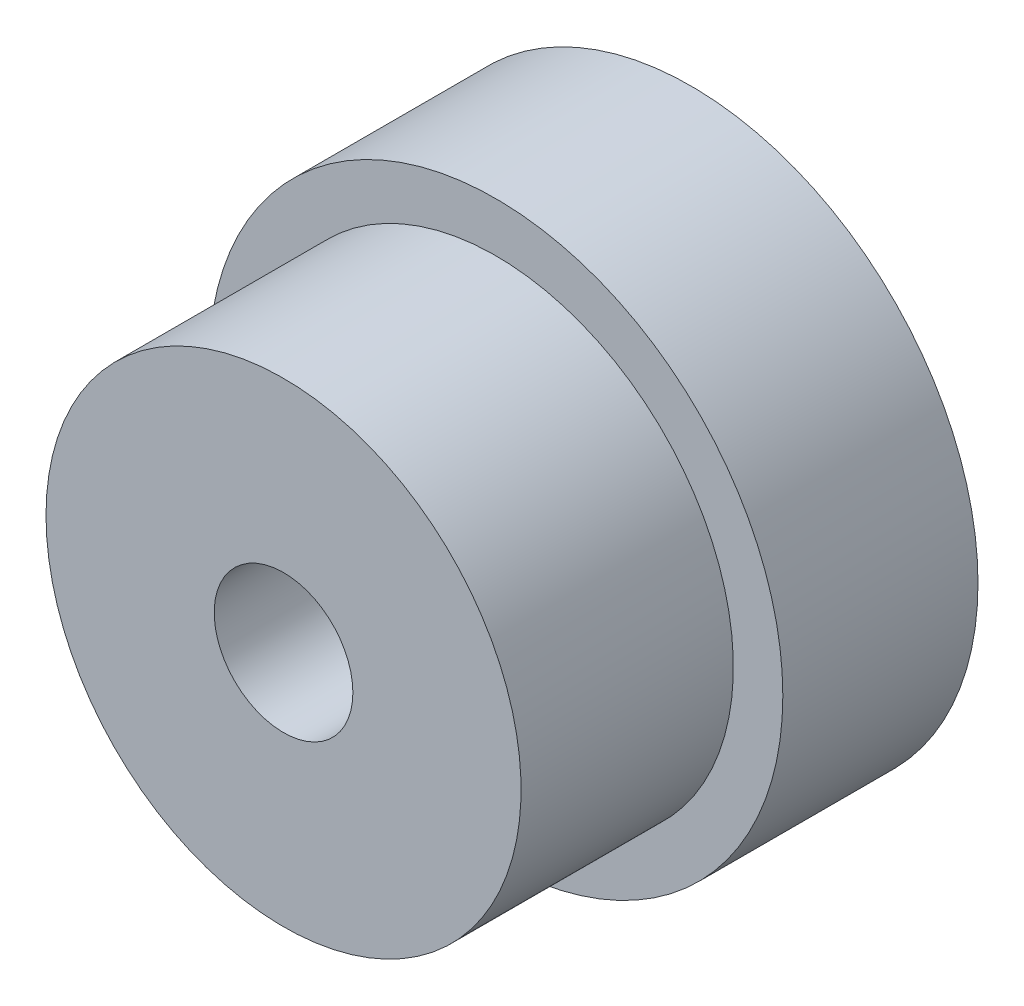
ISO-10303-21;
HEADER;
FILE_DESCRIPTION(('STEP AP214'),'2;1');
FILE_NAME('part.step','',(''),(''),'','','');
FILE_SCHEMA(('AUTOMOTIVE_DESIGN { 1 0 10303 214 1 1 1 1 }'));
ENDSEC;
DATA;
#1=APPLICATION_CONTEXT('core data for automotive mechanical design processes');
#2=APPLICATION_PROTOCOL_DEFINITION('international standard','automotive_design',2000,#1);
#3=PRODUCT_CONTEXT('',#1,'mechanical');
#4=PRODUCT('Part','Part','',(#3));
#5=PRODUCT_RELATED_PRODUCT_CATEGORY('part','',(#4));
#6=PRODUCT_DEFINITION_FORMATION('','',#4);
#7=PRODUCT_DEFINITION_CONTEXT('part definition',#1,'design');
#8=PRODUCT_DEFINITION('design','',#6,#7);
#9=PRODUCT_DEFINITION_SHAPE('','',#8);
#10=(LENGTH_UNIT() NAMED_UNIT(*) SI_UNIT(.MILLI.,.METRE.));
#11=(NAMED_UNIT(*) PLANE_ANGLE_UNIT() SI_UNIT($,.RADIAN.));
#12=(NAMED_UNIT(*) SI_UNIT($,.STERADIAN.) SOLID_ANGLE_UNIT());
#13=UNCERTAINTY_MEASURE_WITH_UNIT(LENGTH_MEASURE(1.E-05),#10,'distance_accuracy_value','');
#14=(GEOMETRIC_REPRESENTATION_CONTEXT(3) GLOBAL_UNCERTAINTY_ASSIGNED_CONTEXT((#13)) GLOBAL_UNIT_ASSIGNED_CONTEXT((#10,
#11,#12)) REPRESENTATION_CONTEXT('',''));
#15=CARTESIAN_POINT('',(0.,0.,0.));
#16=DIRECTION('',(0.,0.,1.));
#17=DIRECTION('',(1.,0.,0.));
#18=AXIS2_PLACEMENT_3D('',#15,#16,#17);
#19=CARTESIAN_POINT('',(0.,0.,11.4));
#20=DIRECTION('',(0.,0.,-1.));
#21=DIRECTION('',(-1.,0.,0.));
#22=AXIS2_PLACEMENT_3D('',#19,#20,#21);
#23=CYLINDRICAL_SURFACE('',#22,16.765);
#24=CARTESIAN_POINT('',(0.,0.,11.4));
#25=DIRECTION('',(0.,0.,1.));
#26=DIRECTION('',(1.,0.,0.));
#27=AXIS2_PLACEMENT_3D('',#24,#25,#26);
#28=CIRCLE('',#27,16.765);
#29=CARTESIAN_POINT('',(16.765,0.,11.4));
#30=VERTEX_POINT('',#29);
#31=EDGE_CURVE('E10',#30,#30,#28,.T.);
#32=ORIENTED_EDGE('',*,*,#31,.F.);
#33=EDGE_LOOP('',(#32));
#34=FACE_BOUND('',#33,.T.);
#35=CARTESIAN_POINT('',(0.,0.,0.));
#36=DIRECTION('',(0.,0.,1.));
#37=DIRECTION('',(1.,0.,0.));
#38=AXIS2_PLACEMENT_3D('',#35,#36,#37);
#39=CIRCLE('',#38,16.765);
#40=CARTESIAN_POINT('',(16.765,0.,0.));
#41=VERTEX_POINT('',#40);
#42=EDGE_CURVE('E34',#41,#41,#39,.T.);
#43=ORIENTED_EDGE('',*,*,#42,.T.);
#44=EDGE_LOOP('',(#43));
#45=FACE_BOUND('',#44,.T.);
#46=ADVANCED_FACE('F31',(#34,#45),#23,.T.);
#47=CARTESIAN_POINT('',(0.,0.,11.4));
#48=DIRECTION('',(0.,0.,1.));
#49=DIRECTION('',(1.,0.,0.));
#50=AXIS2_PLACEMENT_3D('',#47,#48,#49);
#51=PLANE('',#50);
#52=CARTESIAN_POINT('',(0.,0.,11.4));
#53=DIRECTION('',(0.,0.,1.));
#54=DIRECTION('',(1.,0.,0.));
#55=AXIS2_PLACEMENT_3D('',#52,#53,#54);
#56=CIRCLE('',#55,13.875);
#57=CARTESIAN_POINT('',(-13.875,0.,11.4));
#58=VERTEX_POINT('',#57);
#59=EDGE_CURVE('E43',#58,#58,#56,.T.);
#60=ORIENTED_EDGE('',*,*,#59,.F.);
#61=EDGE_LOOP('',(#60));
#62=FACE_BOUND('',#61,.T.);
#63=ORIENTED_EDGE('',*,*,#31,.T.);
#64=EDGE_LOOP('',(#63));
#65=FACE_BOUND('',#64,.T.);
#66=ADVANCED_FACE('F71',(#62,#65),#51,.T.);
#67=CARTESIAN_POINT('',(0.,0.,0.));
#68=DIRECTION('',(0.,0.,1.));
#69=DIRECTION('',(1.,0.,0.));
#70=AXIS2_PLACEMENT_3D('',#67,#68,#69);
#71=PLANE('',#70);
#72=CARTESIAN_POINT('',(0.,0.,0.));
#73=DIRECTION('',(0.,0.,1.));
#74=DIRECTION('',(1.,0.,0.));
#75=AXIS2_PLACEMENT_3D('',#72,#73,#74);
#76=CIRCLE('',#75,4.05);
#77=CARTESIAN_POINT('',(4.05,0.,0.));
#78=VERTEX_POINT('',#77);
#79=EDGE_CURVE('E46',#78,#78,#76,.T.);
#80=ORIENTED_EDGE('',*,*,#79,.T.);
#81=EDGE_LOOP('',(#80));
#82=FACE_BOUND('',#81,.T.);
#83=ORIENTED_EDGE('',*,*,#42,.F.);
#84=EDGE_LOOP('',(#83));
#85=FACE_BOUND('',#84,.T.);
#86=ADVANCED_FACE('F67',(#82,#85),#71,.F.);
#87=CARTESIAN_POINT('',(0.,0.,23.8));
#88=DIRECTION('',(0.,0.,-1.));
#89=DIRECTION('',(-1.,0.,0.));
#90=AXIS2_PLACEMENT_3D('',#87,#88,#89);
#91=CYLINDRICAL_SURFACE('',#90,13.875);
#92=CARTESIAN_POINT('',(0.,0.,23.8));
#93=DIRECTION('',(0.,0.,1.));
#94=DIRECTION('',(1.,0.,0.));
#95=AXIS2_PLACEMENT_3D('',#92,#93,#94);
#96=CIRCLE('',#95,13.875);
#97=CARTESIAN_POINT('',(-13.875,0.,23.8));
#98=VERTEX_POINT('',#97);
#99=EDGE_CURVE('E41',#98,#98,#96,.T.);
#100=CARTESIAN_POINT('',(-13.875,0.,23.8));
#101=CARTESIAN_POINT('',(-13.875,0.,23.6708333333333));
#102=CARTESIAN_POINT('',(-13.875,0.,23.5416666666667));
#103=CARTESIAN_POINT('',(-13.875,0.,23.2833333333333));
#104=CARTESIAN_POINT('',(-13.875,0.,23.1541666666667));
#105=CARTESIAN_POINT('',(-13.875,0.,22.8958333333333));
#106=CARTESIAN_POINT('',(-13.875,0.,22.7666666666667));
#107=CARTESIAN_POINT('',(-13.875,0.,22.5083333333333));
#108=CARTESIAN_POINT('',(-13.875,0.,22.3791666666667));
#109=CARTESIAN_POINT('',(-13.875,0.,22.1208333333333));
#110=CARTESIAN_POINT('',(-13.875,0.,21.9916666666667));
#111=CARTESIAN_POINT('',(-13.875,0.,21.7333333333333));
#112=CARTESIAN_POINT('',(-13.875,0.,21.6041666666667));
#113=CARTESIAN_POINT('',(-13.875,0.,21.3458333333333));
#114=CARTESIAN_POINT('',(-13.875,0.,21.2166666666667));
#115=CARTESIAN_POINT('',(-13.875,0.,20.9583333333333));
#116=CARTESIAN_POINT('',(-13.875,0.,20.8291666666667));
#117=CARTESIAN_POINT('',(-13.875,0.,20.5708333333333));
#118=CARTESIAN_POINT('',(-13.875,0.,20.4416666666667));
#119=CARTESIAN_POINT('',(-13.875,0.,20.1833333333333));
#120=CARTESIAN_POINT('',(-13.875,0.,20.0541666666667));
#121=CARTESIAN_POINT('',(-13.875,0.,19.7958333333333));
#122=CARTESIAN_POINT('',(-13.875,0.,19.6666666666667));
#123=CARTESIAN_POINT('',(-13.875,0.,19.4083333333333));
#124=CARTESIAN_POINT('',(-13.875,0.,19.2791666666667));
#125=CARTESIAN_POINT('',(-13.875,0.,19.0208333333333));
#126=CARTESIAN_POINT('',(-13.875,0.,18.8916666666667));
#127=CARTESIAN_POINT('',(-13.875,0.,18.6333333333333));
#128=CARTESIAN_POINT('',(-13.875,0.,18.5041666666667));
#129=CARTESIAN_POINT('',(-13.875,0.,18.2458333333333));
#130=CARTESIAN_POINT('',(-13.875,0.,18.1166666666667));
#131=CARTESIAN_POINT('',(-13.875,0.,17.8583333333333));
#132=CARTESIAN_POINT('',(-13.875,0.,17.7291666666667));
#133=CARTESIAN_POINT('',(-13.875,0.,17.4708333333333));
#134=CARTESIAN_POINT('',(-13.875,0.,17.3416666666667));
#135=CARTESIAN_POINT('',(-13.875,0.,17.0833333333333));
#136=CARTESIAN_POINT('',(-13.875,0.,16.9541666666667));
#137=CARTESIAN_POINT('',(-13.875,0.,16.6958333333333));
#138=CARTESIAN_POINT('',(-13.875,0.,16.5666666666667));
#139=CARTESIAN_POINT('',(-13.875,0.,16.3083333333333));
#140=CARTESIAN_POINT('',(-13.875,0.,16.1791666666667));
#141=CARTESIAN_POINT('',(-13.875,0.,15.9208333333333));
#142=CARTESIAN_POINT('',(-13.875,0.,15.7916666666667));
#143=CARTESIAN_POINT('',(-13.875,0.,15.5333333333333));
#144=CARTESIAN_POINT('',(-13.875,0.,15.4041666666667));
#145=CARTESIAN_POINT('',(-13.875,0.,15.1458333333333));
#146=CARTESIAN_POINT('',(-13.875,0.,15.0166666666667));
#147=CARTESIAN_POINT('',(-13.875,0.,14.7583333333333));
#148=CARTESIAN_POINT('',(-13.875,0.,14.6291666666667));
#149=CARTESIAN_POINT('',(-13.875,0.,14.3708333333333));
#150=CARTESIAN_POINT('',(-13.875,0.,14.2416666666667));
#151=CARTESIAN_POINT('',(-13.875,0.,13.9833333333333));
#152=CARTESIAN_POINT('',(-13.875,0.,13.8541666666667));
#153=CARTESIAN_POINT('',(-13.875,0.,13.5958333333333));
#154=CARTESIAN_POINT('',(-13.875,0.,13.4666666666667));
#155=CARTESIAN_POINT('',(-13.875,0.,13.2083333333333));
#156=CARTESIAN_POINT('',(-13.875,0.,13.0791666666667));
#157=CARTESIAN_POINT('',(-13.875,0.,12.8208333333333));
#158=CARTESIAN_POINT('',(-13.875,0.,12.6916666666667));
#159=CARTESIAN_POINT('',(-13.875,0.,12.4333333333333));
#160=CARTESIAN_POINT('',(-13.875,0.,12.3041666666667));
#161=CARTESIAN_POINT('',(-13.875,0.,12.0458333333333));
#162=CARTESIAN_POINT('',(-13.875,0.,11.9166666666667));
#163=CARTESIAN_POINT('',(-13.875,0.,11.6583333333333));
#164=CARTESIAN_POINT('',(-13.875,0.,11.5291666666667));
#165=CARTESIAN_POINT('',(-13.875,0.,11.4));
#166=B_SPLINE_CURVE_WITH_KNOTS('',3,(#100,#101,#102,#103,#104,#105,#106,#107,#108,#109,#110,
#111,#112,#113,#114,#115,#116,#117,#118,#119,#120,#121,#122,#123,#124,#125,#126,#127,#128,#129,
#130,#131,#132,#133,#134,#135,#136,#137,#138,#139,#140,#141,#142,#143,#144,#145,#146,#147,#148,
#149,#150,#151,#152,#153,#154,#155,#156,#157,#158,#159,#160,#161,#162,#163,#164,#165),
.UNSPECIFIED.,.F.,.F.,(4,2,2,2,2,2,2,2,2,2,2,2,2,2,2,2,2,2,2,2,2,2,2,2,2,2,2,2,2,2,2,2,4),(0.,
0.387500000000002,0.775000000000001,1.1625,1.55,1.9375,2.325,2.7125,3.1,3.4875,3.875,4.2625,
4.65,5.0375,5.425,5.8125,6.2,6.5875,6.975,7.3625,7.75,8.1375,8.525,8.9125,9.3,9.6875,10.075,
10.4625,10.85,11.2375,11.625,12.0125,12.4),.UNSPECIFIED.);
#167=EDGE_CURVE('BSEAM61',#98,#58,#166,.T.);
#168=ORIENTED_EDGE('',*,*,#99,.F.);
#169=ORIENTED_EDGE('',*,*,#59,.T.);
#170=ORIENTED_EDGE('',*,*,#167,.T.);
#171=ORIENTED_EDGE('',*,*,#167,.F.);
#172=EDGE_LOOP('',(#168,#170,#169,#171));
#173=FACE_BOUND('',#172,.T.);
#174=ADVANCED_FACE('F61',(#173),#91,.T.);
#175=CARTESIAN_POINT('',(0.,0.,23.8));
#176=DIRECTION('',(0.,0.,1.));
#177=DIRECTION('',(1.,0.,0.));
#178=AXIS2_PLACEMENT_3D('',#175,#176,#177);
#179=PLANE('',#178);
#180=CARTESIAN_POINT('',(0.,0.,23.8));
#181=DIRECTION('',(0.,0.,1.));
#182=DIRECTION('',(1.,0.,0.));
#183=AXIS2_PLACEMENT_3D('',#180,#181,#182);
#184=CIRCLE('',#183,4.05);
#185=CARTESIAN_POINT('',(4.05,0.,23.8));
#186=VERTEX_POINT('',#185);
#187=EDGE_CURVE('E51',#186,#186,#184,.T.);
#188=ORIENTED_EDGE('',*,*,#187,.F.);
#189=EDGE_LOOP('',(#188));
#190=FACE_BOUND('',#189,.T.);
#191=ORIENTED_EDGE('',*,*,#99,.T.);
#192=EDGE_LOOP('',(#191));
#193=FACE_BOUND('',#192,.T.);
#194=ADVANCED_FACE('F58',(#190,#193),#179,.T.);
#195=CARTESIAN_POINT('',(0.,0.,-8.6));
#196=DIRECTION('',(0.,0.,1.));
#197=DIRECTION('',(1.,0.,0.));
#198=AXIS2_PLACEMENT_3D('',#195,#196,#197);
#199=CYLINDRICAL_SURFACE('',#198,4.05);
#200=ORIENTED_EDGE('',*,*,#187,.T.);
#201=EDGE_LOOP('',(#200));
#202=FACE_BOUND('',#201,.T.);
#203=ORIENTED_EDGE('',*,*,#79,.F.);
#204=EDGE_LOOP('',(#203));
#205=FACE_BOUND('',#204,.T.);
#206=ADVANCED_FACE('F55',(#202,#205),#199,.F.);
#207=CLOSED_SHELL('',(#46,#66,#86,#174,#194,#206));
#208=MANIFOLD_SOLID_BREP('B2',#207);
#209=ADVANCED_BREP_SHAPE_REPRESENTATION('',(#18,#208),#14);
#210=SHAPE_DEFINITION_REPRESENTATION(#9,#209);
ENDSEC;
END-ISO-10303-21;
